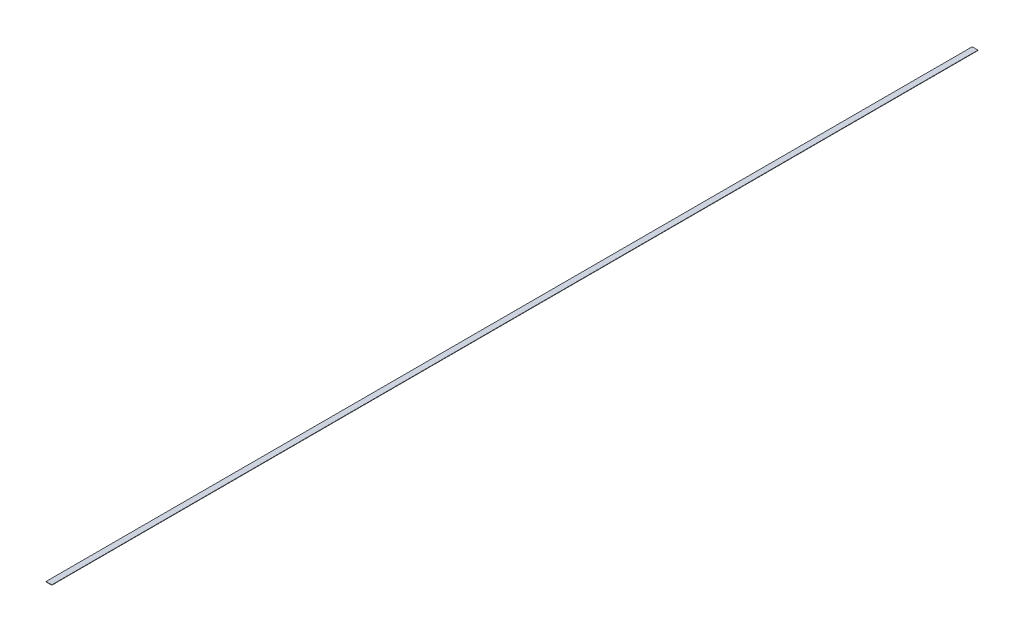
ISO-10303-21;
HEADER;
FILE_DESCRIPTION(('STEP AP214'),'2;1');
FILE_NAME('part.step','',(''),(''),'','','');
FILE_SCHEMA(('AUTOMOTIVE_DESIGN { 1 0 10303 214 1 1 1 1 }'));
ENDSEC;
DATA;
#1=APPLICATION_CONTEXT('core data for automotive mechanical design processes');
#2=APPLICATION_PROTOCOL_DEFINITION('international standard','automotive_design',2000,#1);
#3=PRODUCT_CONTEXT('',#1,'mechanical');
#4=PRODUCT('Part','Part','',(#3));
#5=PRODUCT_RELATED_PRODUCT_CATEGORY('part','',(#4));
#6=PRODUCT_DEFINITION_FORMATION('','',#4);
#7=PRODUCT_DEFINITION_CONTEXT('part definition',#1,'design');
#8=PRODUCT_DEFINITION('design','',#6,#7);
#9=PRODUCT_DEFINITION_SHAPE('','',#8);
#10=(LENGTH_UNIT() NAMED_UNIT(*) SI_UNIT(.MILLI.,.METRE.));
#11=(NAMED_UNIT(*) PLANE_ANGLE_UNIT() SI_UNIT($,.RADIAN.));
#12=(NAMED_UNIT(*) SI_UNIT($,.STERADIAN.) SOLID_ANGLE_UNIT());
#13=UNCERTAINTY_MEASURE_WITH_UNIT(LENGTH_MEASURE(1.E-05),#10,'distance_accuracy_value','');
#14=(GEOMETRIC_REPRESENTATION_CONTEXT(3) GLOBAL_UNCERTAINTY_ASSIGNED_CONTEXT((#13)) GLOBAL_UNIT_ASSIGNED_CONTEXT((#10,
#11,#12)) REPRESENTATION_CONTEXT('',''));
#15=CARTESIAN_POINT('',(0.,0.,0.));
#16=DIRECTION('',(0.,0.,1.));
#17=DIRECTION('',(1.,0.,0.));
#18=AXIS2_PLACEMENT_3D('',#15,#16,#17);
#19=CARTESIAN_POINT('',(0.,3.175,0.));
#20=DIRECTION('',(0.,1.,0.));
#21=DIRECTION('',(0.,0.,1.));
#22=AXIS2_PLACEMENT_3D('',#19,#20,#21);
#23=PLANE('',#22);
#24=DIRECTION('',(-1.,0.,0.));
#25=VECTOR('',#24,1.);
#26=CARTESIAN_POINT('',(25.4,3.175,-4067.175));
#27=LINE('',#26,#25);
#28=CARTESIAN_POINT('',(-25.4,3.175,-4067.175));
#29=VERTEX_POINT('',#28);
#30=CARTESIAN_POINT('',(25.4,3.175,-4067.175));
#31=VERTEX_POINT('',#30);
#32=EDGE_CURVE('E68',#29,#31,#27,.F.);
#33=ORIENTED_EDGE('',*,*,#32,.F.);
#34=DIRECTION('',(0.,0.,1.));
#35=VECTOR('',#34,1.);
#36=CARTESIAN_POINT('',(-25.4,3.175,-4067.175));
#37=LINE('',#36,#35);
#38=CARTESIAN_POINT('',(-25.4,3.175,4067.175));
#39=VERTEX_POINT('',#38);
#40=EDGE_CURVE('E20',#39,#29,#37,.F.);
#41=ORIENTED_EDGE('',*,*,#40,.F.);
#42=DIRECTION('',(1.,0.,0.));
#43=VECTOR('',#42,1.);
#44=CARTESIAN_POINT('',(-25.4,3.175,4067.175));
#45=LINE('',#44,#43);
#46=CARTESIAN_POINT('',(25.4,3.175,4067.175));
#47=VERTEX_POINT('',#46);
#48=EDGE_CURVE('E58',#47,#39,#45,.F.);
#49=ORIENTED_EDGE('',*,*,#48,.F.);
#50=DIRECTION('',(0.,0.,-1.));
#51=VECTOR('',#50,1.);
#52=CARTESIAN_POINT('',(25.4,3.175,4067.175));
#53=LINE('',#52,#51);
#54=EDGE_CURVE('E53',#31,#47,#53,.F.);
#55=ORIENTED_EDGE('',*,*,#54,.F.);
#56=EDGE_LOOP('',(#33,#41,#49,#55));
#57=FACE_BOUND('',#56,.T.);
#58=ADVANCED_FACE('F17',(#57),#23,.T.);
#59=CARTESIAN_POINT('',(-25.4,0.,-4067.175));
#60=DIRECTION('',(-1.,0.,0.));
#61=DIRECTION('',(0.,0.,1.));
#62=AXIS2_PLACEMENT_3D('',#59,#60,#61);
#63=PLANE('',#62);
#64=DIRECTION('',(0.,1.,0.));
#65=VECTOR('',#64,1.);
#66=CARTESIAN_POINT('',(-25.4,0.,-4067.175));
#67=LINE('',#66,#65);
#68=CARTESIAN_POINT('',(-25.4,0.,-4067.175));
#69=VERTEX_POINT('',#68);
#70=EDGE_CURVE('E79',#69,#29,#67,.T.);
#71=ORIENTED_EDGE('',*,*,#70,.F.);
#72=DIRECTION('',(0.,0.,1.));
#73=VECTOR('',#72,1.);
#74=CARTESIAN_POINT('',(-25.4,0.,0.));
#75=LINE('',#74,#73);
#76=CARTESIAN_POINT('',(-25.4,0.,4067.175));
#77=VERTEX_POINT('',#76);
#78=EDGE_CURVE('E74',#69,#77,#75,.T.);
#79=ORIENTED_EDGE('',*,*,#78,.T.);
#80=DIRECTION('',(0.,1.,0.));
#81=VECTOR('',#80,1.);
#82=CARTESIAN_POINT('',(-25.4,0.,4067.175));
#83=LINE('',#82,#81);
#84=EDGE_CURVE('E63',#39,#77,#83,.F.);
#85=ORIENTED_EDGE('',*,*,#84,.F.);
#86=ORIENTED_EDGE('',*,*,#40,.T.);
#87=EDGE_LOOP('',(#71,#79,#85,#86));
#88=FACE_BOUND('',#87,.T.);
#89=ADVANCED_FACE('F73',(#88),#63,.T.);
#90=CARTESIAN_POINT('',(-25.4,0.,4067.175));
#91=DIRECTION('',(0.,0.,1.));
#92=DIRECTION('',(1.,0.,0.));
#93=AXIS2_PLACEMENT_3D('',#90,#91,#92);
#94=PLANE('',#93);
#95=ORIENTED_EDGE('',*,*,#84,.T.);
#96=DIRECTION('',(1.,0.,0.));
#97=VECTOR('',#96,1.);
#98=CARTESIAN_POINT('',(0.,0.,4067.175));
#99=LINE('',#98,#97);
#100=CARTESIAN_POINT('',(25.4,0.,4067.175));
#101=VERTEX_POINT('',#100);
#102=EDGE_CURVE('E84',#77,#101,#99,.T.);
#103=ORIENTED_EDGE('',*,*,#102,.T.);
#104=DIRECTION('',(0.,1.,0.));
#105=VECTOR('',#104,1.);
#106=CARTESIAN_POINT('',(25.4,0.,4067.175));
#107=LINE('',#106,#105);
#108=EDGE_CURVE('E65',#47,#101,#107,.F.);
#109=ORIENTED_EDGE('',*,*,#108,.F.);
#110=ORIENTED_EDGE('',*,*,#48,.T.);
#111=EDGE_LOOP('',(#95,#103,#109,#110));
#112=FACE_BOUND('',#111,.T.);
#113=ADVANCED_FACE('F60',(#112),#94,.T.);
#114=CARTESIAN_POINT('',(25.4,0.,4067.175));
#115=DIRECTION('',(1.,0.,0.));
#116=DIRECTION('',(0.,0.,-1.));
#117=AXIS2_PLACEMENT_3D('',#114,#115,#116);
#118=PLANE('',#117);
#119=ORIENTED_EDGE('',*,*,#108,.T.);
#120=DIRECTION('',(0.,0.,1.));
#121=VECTOR('',#120,1.);
#122=CARTESIAN_POINT('',(25.4,0.,0.));
#123=LINE('',#122,#121);
#124=CARTESIAN_POINT('',(25.4,0.,-4067.175));
#125=VERTEX_POINT('',#124);
#126=EDGE_CURVE('E26',#101,#125,#123,.F.);
#127=ORIENTED_EDGE('',*,*,#126,.T.);
#128=DIRECTION('',(0.,1.,0.));
#129=VECTOR('',#128,1.);
#130=CARTESIAN_POINT('',(25.4,0.,-4067.175));
#131=LINE('',#130,#129);
#132=EDGE_CURVE('E34',#31,#125,#131,.F.);
#133=ORIENTED_EDGE('',*,*,#132,.F.);
#134=ORIENTED_EDGE('',*,*,#54,.T.);
#135=EDGE_LOOP('',(#119,#127,#133,#134));
#136=FACE_BOUND('',#135,.T.);
#137=ADVANCED_FACE('F88',(#136),#118,.T.);
#138=CARTESIAN_POINT('',(25.4,0.,-4067.175));
#139=DIRECTION('',(0.,0.,-1.));
#140=DIRECTION('',(-1.,0.,0.));
#141=AXIS2_PLACEMENT_3D('',#138,#139,#140);
#142=PLANE('',#141);
#143=ORIENTED_EDGE('',*,*,#132,.T.);
#144=DIRECTION('',(1.,0.,0.));
#145=VECTOR('',#144,1.);
#146=CARTESIAN_POINT('',(0.,0.,-4067.175));
#147=LINE('',#146,#145);
#148=EDGE_CURVE('E11',#125,#69,#147,.F.);
#149=ORIENTED_EDGE('',*,*,#148,.T.);
#150=ORIENTED_EDGE('',*,*,#70,.T.);
#151=ORIENTED_EDGE('',*,*,#32,.T.);
#152=EDGE_LOOP('',(#143,#149,#150,#151));
#153=FACE_BOUND('',#152,.T.);
#154=ADVANCED_FACE('F91',(#153),#142,.T.);
#155=CARTESIAN_POINT('',(0.,0.,0.));
#156=DIRECTION('',(0.,1.,0.));
#157=DIRECTION('',(0.,0.,1.));
#158=AXIS2_PLACEMENT_3D('',#155,#156,#157);
#159=PLANE('',#158);
#160=ORIENTED_EDGE('',*,*,#126,.F.);
#161=ORIENTED_EDGE('',*,*,#102,.F.);
#162=ORIENTED_EDGE('',*,*,#78,.F.);
#163=ORIENTED_EDGE('',*,*,#148,.F.);
#164=EDGE_LOOP('',(#160,#161,#162,#163));
#165=FACE_BOUND('',#164,.T.);
#166=ADVANCED_FACE('F90',(#165),#159,.F.);
#167=CLOSED_SHELL('',(#58,#89,#113,#137,#154,#166));
#168=MANIFOLD_SOLID_BREP('B1',#167);
#169=ADVANCED_BREP_SHAPE_REPRESENTATION('',(#18,#168),#14);
#170=SHAPE_DEFINITION_REPRESENTATION(#9,#169);
ENDSEC;
END-ISO-10303-21;
